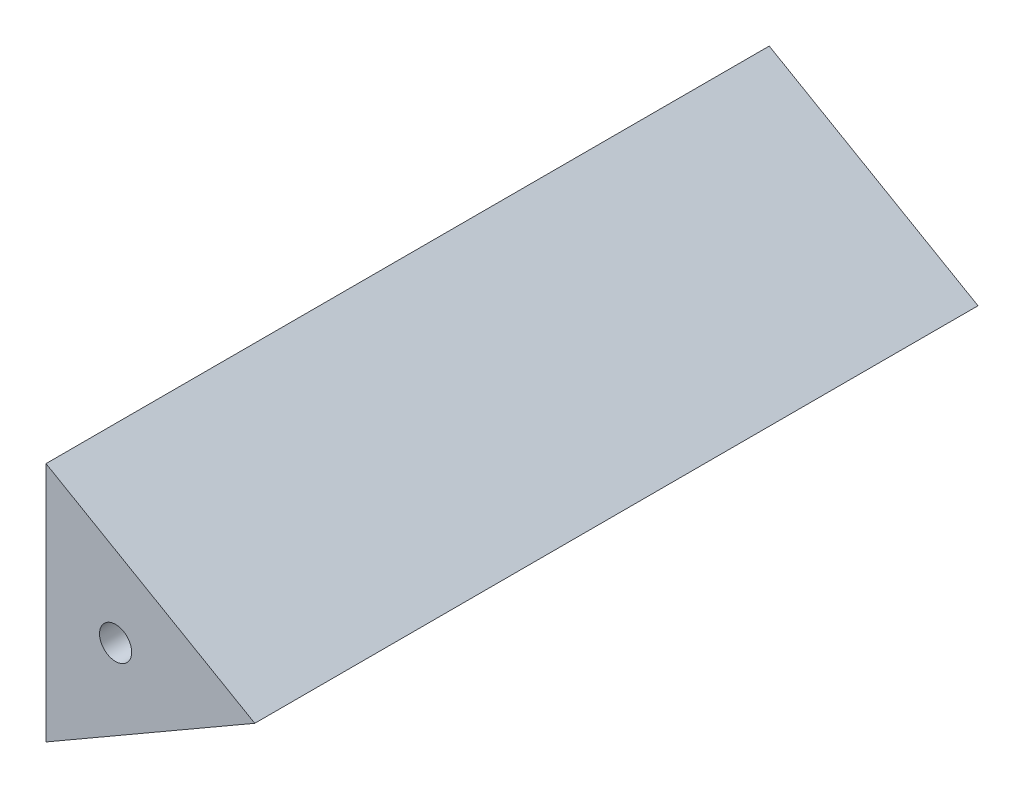
ISO-10303-21;
HEADER;
FILE_DESCRIPTION(('STEP AP214'),'2;1');
FILE_NAME('part.step','',(''),(''),'','','');
FILE_SCHEMA(('AUTOMOTIVE_DESIGN { 1 0 10303 214 1 1 1 1 }'));
ENDSEC;
DATA;
#1=APPLICATION_CONTEXT('core data for automotive mechanical design processes');
#2=APPLICATION_PROTOCOL_DEFINITION('international standard','automotive_design',2000,#1);
#3=PRODUCT_CONTEXT('',#1,'mechanical');
#4=PRODUCT('Part','Part','',(#3));
#5=PRODUCT_RELATED_PRODUCT_CATEGORY('part','',(#4));
#6=PRODUCT_DEFINITION_FORMATION('','',#4);
#7=PRODUCT_DEFINITION_CONTEXT('part definition',#1,'design');
#8=PRODUCT_DEFINITION('design','',#6,#7);
#9=PRODUCT_DEFINITION_SHAPE('','',#8);
#10=(LENGTH_UNIT() NAMED_UNIT(*) SI_UNIT(.MILLI.,.METRE.));
#11=(NAMED_UNIT(*) PLANE_ANGLE_UNIT() SI_UNIT($,.RADIAN.));
#12=(NAMED_UNIT(*) SI_UNIT($,.STERADIAN.) SOLID_ANGLE_UNIT());
#13=UNCERTAINTY_MEASURE_WITH_UNIT(LENGTH_MEASURE(1.E-05),#10,'distance_accuracy_value','');
#14=(GEOMETRIC_REPRESENTATION_CONTEXT(3) GLOBAL_UNCERTAINTY_ASSIGNED_CONTEXT((#13)) GLOBAL_UNIT_ASSIGNED_CONTEXT((#10,
#11,#12)) REPRESENTATION_CONTEXT('',''));
#15=CARTESIAN_POINT('',(0.,0.,0.));
#16=DIRECTION('',(0.,0.,1.));
#17=DIRECTION('',(1.,0.,0.));
#18=AXIS2_PLACEMENT_3D('',#15,#16,#17);
#19=CARTESIAN_POINT('',(0.,0.,180.));
#20=DIRECTION('',(0.,0.,1.));
#21=DIRECTION('',(1.,0.,0.));
#22=AXIS2_PLACEMENT_3D('',#19,#20,#21);
#23=PLANE('',#22);
#24=DIRECTION('',(0.866025403784438,0.5,0.));
#25=VECTOR('',#24,1.);
#26=CARTESIAN_POINT('',(-17.3200000000001,-29.9991199870931,180.));
#27=LINE('',#26,#25);
#28=CARTESIAN_POINT('',(-17.3200000000001,-29.9991199870931,180.));
#29=VERTEX_POINT('',#28);
#30=CARTESIAN_POINT('',(34.6400000000001,0.,180.));
#31=VERTEX_POINT('',#30);
#32=EDGE_CURVE('E82',#29,#31,#27,.T.);
#33=ORIENTED_EDGE('',*,*,#32,.T.);
#34=DIRECTION('',(-0.866025403784439,0.5,0.));
#35=VECTOR('',#34,1.);
#36=CARTESIAN_POINT('',(34.6400000000001,0.,180.));
#37=LINE('',#36,#35);
#38=CARTESIAN_POINT('',(-17.3200000000001,29.9991199870931,180.));
#39=VERTEX_POINT('',#38);
#40=EDGE_CURVE('E77',#31,#39,#37,.T.);
#41=ORIENTED_EDGE('',*,*,#40,.T.);
#42=DIRECTION('',(0.,-1.,0.));
#43=VECTOR('',#42,1.);
#44=CARTESIAN_POINT('',(-17.3200000000001,29.9991199870931,180.));
#45=LINE('',#44,#43);
#46=EDGE_CURVE('E57',#39,#29,#45,.T.);
#47=ORIENTED_EDGE('',*,*,#46,.T.);
#48=EDGE_LOOP('',(#33,#41,#47));
#49=FACE_BOUND('',#48,.T.);
#50=CARTESIAN_POINT('',(0.,0.,180.));
#51=DIRECTION('',(0.,0.,1.));
#52=DIRECTION('',(1.,0.,0.));
#53=AXIS2_PLACEMENT_3D('',#50,#51,#52);
#54=CIRCLE('',#53,4.);
#55=CARTESIAN_POINT('',(4.,0.,180.));
#56=VERTEX_POINT('',#55);
#57=EDGE_CURVE('E94',#56,#56,#54,.T.);
#58=ORIENTED_EDGE('',*,*,#57,.F.);
#59=EDGE_LOOP('',(#58));
#60=FACE_BOUND('',#59,.T.);
#61=ADVANCED_FACE('F39',(#49,#60),#23,.T.);
#62=CARTESIAN_POINT('',(0.,0.,0.));
#63=DIRECTION('',(0.,0.,1.));
#64=DIRECTION('',(1.,0.,0.));
#65=AXIS2_PLACEMENT_3D('',#62,#63,#64);
#66=PLANE('',#65);
#67=DIRECTION('',(0.866025403784438,0.5,0.));
#68=VECTOR('',#67,1.);
#69=CARTESIAN_POINT('',(-17.3200000000001,-29.9991199870931,0.));
#70=LINE('',#69,#68);
#71=CARTESIAN_POINT('',(-17.3200000000001,-29.9991199870931,0.));
#72=VERTEX_POINT('',#71);
#73=CARTESIAN_POINT('',(34.6400000000001,0.,0.));
#74=VERTEX_POINT('',#73);
#75=EDGE_CURVE('E90',#72,#74,#70,.T.);
#76=ORIENTED_EDGE('',*,*,#75,.F.);
#77=DIRECTION('',(0.,-1.,0.));
#78=VECTOR('',#77,1.);
#79=CARTESIAN_POINT('',(-17.3200000000001,29.9991199870931,0.));
#80=LINE('',#79,#78);
#81=CARTESIAN_POINT('',(-17.3200000000001,29.9991199870931,0.));
#82=VERTEX_POINT('',#81);
#83=EDGE_CURVE('E74',#82,#72,#80,.T.);
#84=ORIENTED_EDGE('',*,*,#83,.F.);
#85=DIRECTION('',(-0.866025403784439,0.5,0.));
#86=VECTOR('',#85,1.);
#87=CARTESIAN_POINT('',(34.6400000000001,0.,0.));
#88=LINE('',#87,#86);
#89=EDGE_CURVE('E69',#74,#82,#88,.T.);
#90=ORIENTED_EDGE('',*,*,#89,.F.);
#91=EDGE_LOOP('',(#76,#84,#90));
#92=FACE_BOUND('',#91,.T.);
#93=CARTESIAN_POINT('',(0.,0.,0.));
#94=DIRECTION('',(0.,0.,1.));
#95=DIRECTION('',(1.,0.,0.));
#96=AXIS2_PLACEMENT_3D('',#93,#94,#95);
#97=CIRCLE('',#96,4.);
#98=CARTESIAN_POINT('',(4.,0.,0.));
#99=VERTEX_POINT('',#98);
#100=EDGE_CURVE('E100',#99,#99,#97,.T.);
#101=ORIENTED_EDGE('',*,*,#100,.T.);
#102=EDGE_LOOP('',(#101));
#103=FACE_BOUND('',#102,.T.);
#104=ADVANCED_FACE('F109',(#92,#103),#66,.F.);
#105=CARTESIAN_POINT('',(-17.3200000000001,-29.9991199870931,180.));
#106=DIRECTION('',(-0.5,0.866025403784439,0.));
#107=DIRECTION('',(-0.866025403784438,-0.5,0.));
#108=AXIS2_PLACEMENT_3D('',#105,#106,#107);
#109=PLANE('',#108);
#110=ORIENTED_EDGE('',*,*,#75,.T.);
#111=DIRECTION('',(0.,0.,-1.));
#112=VECTOR('',#111,1.);
#113=CARTESIAN_POINT('',(34.6400000000001,0.,180.));
#114=LINE('',#113,#112);
#115=EDGE_CURVE('E11',#31,#74,#114,.T.);
#116=ORIENTED_EDGE('',*,*,#115,.F.);
#117=ORIENTED_EDGE('',*,*,#32,.F.);
#118=DIRECTION('',(0.,0.,-1.));
#119=VECTOR('',#118,1.);
#120=CARTESIAN_POINT('',(-17.3200000000001,-29.9991199870931,180.));
#121=LINE('',#120,#119);
#122=EDGE_CURVE('E91',#29,#72,#121,.T.);
#123=ORIENTED_EDGE('',*,*,#122,.T.);
#124=EDGE_LOOP('',(#110,#116,#117,#123));
#125=FACE_BOUND('',#124,.T.);
#126=ADVANCED_FACE('F41',(#125),#109,.F.);
#127=CARTESIAN_POINT('',(34.6400000000001,0.,180.));
#128=DIRECTION('',(-0.5,-0.866025403784439,0.));
#129=DIRECTION('',(0.866025403784439,-0.5,0.));
#130=AXIS2_PLACEMENT_3D('',#127,#128,#129);
#131=PLANE('',#130);
#132=ORIENTED_EDGE('',*,*,#89,.T.);
#133=DIRECTION('',(0.,0.,-1.));
#134=VECTOR('',#133,1.);
#135=CARTESIAN_POINT('',(-17.3200000000001,29.9991199870931,180.));
#136=LINE('',#135,#134);
#137=EDGE_CURVE('E49',#39,#82,#136,.T.);
#138=ORIENTED_EDGE('',*,*,#137,.F.);
#139=ORIENTED_EDGE('',*,*,#40,.F.);
#140=ORIENTED_EDGE('',*,*,#115,.T.);
#141=EDGE_LOOP('',(#132,#138,#139,#140));
#142=FACE_BOUND('',#141,.T.);
#143=ADVANCED_FACE('F78',(#142),#131,.F.);
#144=CARTESIAN_POINT('',(-17.3200000000001,29.9991199870931,180.));
#145=DIRECTION('',(1.,0.,0.));
#146=DIRECTION('',(0.,1.,0.));
#147=AXIS2_PLACEMENT_3D('',#144,#145,#146);
#148=PLANE('',#147);
#149=ORIENTED_EDGE('',*,*,#83,.T.);
#150=ORIENTED_EDGE('',*,*,#122,.F.);
#151=ORIENTED_EDGE('',*,*,#46,.F.);
#152=ORIENTED_EDGE('',*,*,#137,.T.);
#153=EDGE_LOOP('',(#149,#150,#151,#152));
#154=FACE_BOUND('',#153,.T.);
#155=ADVANCED_FACE('F108',(#154),#148,.F.);
#156=CARTESIAN_POINT('',(0.,0.,180.));
#157=DIRECTION('',(0.,0.,-1.));
#158=DIRECTION('',(-1.,0.,0.));
#159=AXIS2_PLACEMENT_3D('',#156,#157,#158);
#160=CYLINDRICAL_SURFACE('',#159,4.);
#161=ORIENTED_EDGE('',*,*,#57,.T.);
#162=EDGE_LOOP('',(#161));
#163=FACE_BOUND('',#162,.T.);
#164=ORIENTED_EDGE('',*,*,#100,.F.);
#165=EDGE_LOOP('',(#164));
#166=FACE_BOUND('',#165,.T.);
#167=ADVANCED_FACE('F118',(#163,#166),#160,.F.);
#168=CLOSED_SHELL('',(#61,#104,#126,#143,#155,#167));
#169=MANIFOLD_SOLID_BREP('B2',#168);
#170=ADVANCED_BREP_SHAPE_REPRESENTATION('',(#18,#169),#14);
#171=SHAPE_DEFINITION_REPRESENTATION(#9,#170);
ENDSEC;
END-ISO-10303-21;
